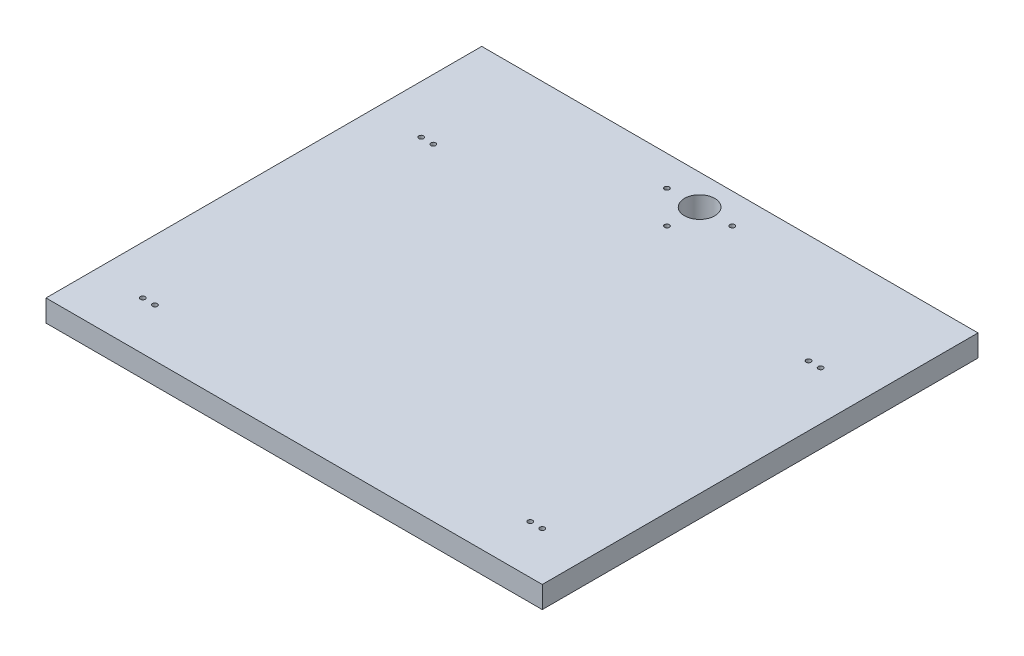
ISO-10303-21;
HEADER;
FILE_DESCRIPTION(('STEP AP214'),'2;1');
FILE_NAME('part.step','',(''),(''),'','','');
FILE_SCHEMA(('AUTOMOTIVE_DESIGN { 1 0 10303 214 1 1 1 1 }'));
ENDSEC;
DATA;
#1=APPLICATION_CONTEXT('core data for automotive mechanical design processes');
#2=APPLICATION_PROTOCOL_DEFINITION('international standard','automotive_design',2000,#1);
#3=PRODUCT_CONTEXT('',#1,'mechanical');
#4=PRODUCT('Part','Part','',(#3));
#5=PRODUCT_RELATED_PRODUCT_CATEGORY('part','',(#4));
#6=PRODUCT_DEFINITION_FORMATION('','',#4);
#7=PRODUCT_DEFINITION_CONTEXT('part definition',#1,'design');
#8=PRODUCT_DEFINITION('design','',#6,#7);
#9=PRODUCT_DEFINITION_SHAPE('','',#8);
#10=(LENGTH_UNIT() NAMED_UNIT(*) SI_UNIT(.MILLI.,.METRE.));
#11=(NAMED_UNIT(*) PLANE_ANGLE_UNIT() SI_UNIT($,.RADIAN.));
#12=(NAMED_UNIT(*) SI_UNIT($,.STERADIAN.) SOLID_ANGLE_UNIT());
#13=UNCERTAINTY_MEASURE_WITH_UNIT(LENGTH_MEASURE(1.E-05),#10,'distance_accuracy_value','');
#14=(GEOMETRIC_REPRESENTATION_CONTEXT(3) GLOBAL_UNCERTAINTY_ASSIGNED_CONTEXT((#13)) GLOBAL_UNIT_ASSIGNED_CONTEXT((#10,
#11,#12)) REPRESENTATION_CONTEXT('',''));
#15=CARTESIAN_POINT('',(0.,0.,0.));
#16=DIRECTION('',(0.,0.,1.));
#17=DIRECTION('',(1.,0.,0.));
#18=AXIS2_PLACEMENT_3D('',#15,#16,#17);
#19=CARTESIAN_POINT('',(40.,0.,-40.));
#20=DIRECTION('',(0.,1.,0.));
#21=DIRECTION('',(0.,0.,1.));
#22=AXIS2_PLACEMENT_3D('',#19,#20,#21);
#23=CYLINDRICAL_SURFACE('',#22,2.);
#24=CARTESIAN_POINT('',(40.,18.,-40.));
#25=DIRECTION('',(0.,1.,0.));
#26=DIRECTION('',(0.,0.,1.));
#27=AXIS2_PLACEMENT_3D('',#24,#25,#26);
#28=CIRCLE('',#27,2.);
#29=CARTESIAN_POINT('',(40.,18.,-38.));
#30=VERTEX_POINT('',#29);
#31=EDGE_CURVE('E2252',#30,#30,#28,.T.);
#32=ORIENTED_EDGE('',*,*,#31,.T.);
#33=EDGE_LOOP('',(#32));
#34=FACE_BOUND('',#33,.T.);
#35=CARTESIAN_POINT('',(40.,8.,-40.));
#36=DIRECTION('',(0.,-1.,0.));
#37=DIRECTION('',(0.,0.,-1.));
#38=AXIS2_PLACEMENT_3D('',#35,#36,#37);
#39=CIRCLE('',#38,2.);
#40=CARTESIAN_POINT('',(40.,8.,-42.));
#41=VERTEX_POINT('',#40);
#42=EDGE_CURVE('E2095',#41,#41,#39,.F.);
#43=ORIENTED_EDGE('',*,*,#42,.F.);
#44=EDGE_LOOP('',(#43));
#45=FACE_BOUND('',#44,.T.);
#46=ADVANCED_FACE('F2087',(#34,#45),#23,.F.);
#47=CARTESIAN_POINT('',(360.,0.,-270.));
#48=DIRECTION('',(0.,1.,0.));
#49=DIRECTION('',(0.,0.,1.));
#50=AXIS2_PLACEMENT_3D('',#47,#48,#49);
#51=CYLINDRICAL_SURFACE('',#50,2.);
#52=CARTESIAN_POINT('',(360.,18.,-270.));
#53=DIRECTION('',(0.,1.,0.));
#54=DIRECTION('',(0.,0.,1.));
#55=AXIS2_PLACEMENT_3D('',#52,#53,#54);
#56=CIRCLE('',#55,2.);
#57=CARTESIAN_POINT('',(360.,18.,-268.));
#58=VERTEX_POINT('',#57);
#59=EDGE_CURVE('E2242',#58,#58,#56,.T.);
#60=ORIENTED_EDGE('',*,*,#59,.T.);
#61=EDGE_LOOP('',(#60));
#62=FACE_BOUND('',#61,.T.);
#63=CARTESIAN_POINT('',(360.,8.,-270.));
#64=DIRECTION('',(0.,-1.,0.));
#65=DIRECTION('',(0.,0.,-1.));
#66=AXIS2_PLACEMENT_3D('',#63,#64,#65);
#67=CIRCLE('',#66,2.);
#68=CARTESIAN_POINT('',(360.,8.,-272.));
#69=VERTEX_POINT('',#68);
#70=EDGE_CURVE('E2215',#69,#69,#67,.F.);
#71=ORIENTED_EDGE('',*,*,#70,.F.);
#72=EDGE_LOOP('',(#71));
#73=FACE_BOUND('',#72,.T.);
#74=ADVANCED_FACE('F2414',(#62,#73),#51,.F.);
#75=CARTESIAN_POINT('',(40.,0.,-270.));
#76=DIRECTION('',(0.,1.,0.));
#77=DIRECTION('',(0.,0.,1.));
#78=AXIS2_PLACEMENT_3D('',#75,#76,#77);
#79=CYLINDRICAL_SURFACE('',#78,2.);
#80=CARTESIAN_POINT('',(40.,18.,-270.));
#81=DIRECTION('',(0.,1.,0.));
#82=DIRECTION('',(0.,0.,1.));
#83=AXIS2_PLACEMENT_3D('',#80,#81,#82);
#84=CIRCLE('',#83,2.);
#85=CARTESIAN_POINT('',(40.,18.,-268.));
#86=VERTEX_POINT('',#85);
#87=EDGE_CURVE('E2243',#86,#86,#84,.T.);
#88=ORIENTED_EDGE('',*,*,#87,.T.);
#89=EDGE_LOOP('',(#88));
#90=FACE_BOUND('',#89,.T.);
#91=CARTESIAN_POINT('',(40.,8.,-270.));
#92=DIRECTION('',(0.,-1.,0.));
#93=DIRECTION('',(0.,0.,-1.));
#94=AXIS2_PLACEMENT_3D('',#91,#92,#93);
#95=CIRCLE('',#94,2.);
#96=CARTESIAN_POINT('',(40.,8.,-272.));
#97=VERTEX_POINT('',#96);
#98=EDGE_CURVE('E2208',#97,#97,#95,.F.);
#99=ORIENTED_EDGE('',*,*,#98,.F.);
#100=EDGE_LOOP('',(#99));
#101=FACE_BOUND('',#100,.T.);
#102=ADVANCED_FACE('F2424',(#90,#101),#79,.F.);
#103=CARTESIAN_POINT('',(50.,0.,-270.));
#104=DIRECTION('',(0.,1.,0.));
#105=DIRECTION('',(0.,0.,1.));
#106=AXIS2_PLACEMENT_3D('',#103,#104,#105);
#107=CYLINDRICAL_SURFACE('',#106,2.);
#108=CARTESIAN_POINT('',(50.,18.,-270.));
#109=DIRECTION('',(0.,1.,0.));
#110=DIRECTION('',(0.,0.,1.));
#111=AXIS2_PLACEMENT_3D('',#108,#109,#110);
#112=CIRCLE('',#111,2.);
#113=CARTESIAN_POINT('',(50.,18.,-268.));
#114=VERTEX_POINT('',#113);
#115=EDGE_CURVE('E2236',#114,#114,#112,.T.);
#116=ORIENTED_EDGE('',*,*,#115,.T.);
#117=EDGE_LOOP('',(#116));
#118=FACE_BOUND('',#117,.T.);
#119=CARTESIAN_POINT('',(50.,8.,-270.));
#120=DIRECTION('',(0.,-1.,0.));
#121=DIRECTION('',(0.,0.,-1.));
#122=AXIS2_PLACEMENT_3D('',#119,#120,#121);
#123=CIRCLE('',#122,2.);
#124=CARTESIAN_POINT('',(50.,8.,-272.));
#125=VERTEX_POINT('',#124);
#126=EDGE_CURVE('E2203',#125,#125,#123,.F.);
#127=ORIENTED_EDGE('',*,*,#126,.F.);
#128=EDGE_LOOP('',(#127));
#129=FACE_BOUND('',#128,.T.);
#130=ADVANCED_FACE('F2537',(#118,#129),#107,.F.);
#131=CARTESIAN_POINT('',(370.,0.,-270.));
#132=DIRECTION('',(0.,1.,0.));
#133=DIRECTION('',(0.,0.,1.));
#134=AXIS2_PLACEMENT_3D('',#131,#132,#133);
#135=CYLINDRICAL_SURFACE('',#134,2.);
#136=CARTESIAN_POINT('',(370.,18.,-270.));
#137=DIRECTION('',(0.,1.,0.));
#138=DIRECTION('',(0.,0.,1.));
#139=AXIS2_PLACEMENT_3D('',#136,#137,#138);
#140=CIRCLE('',#139,2.);
#141=CARTESIAN_POINT('',(370.,18.,-268.));
#142=VERTEX_POINT('',#141);
#143=EDGE_CURVE('E2248',#142,#142,#140,.T.);
#144=ORIENTED_EDGE('',*,*,#143,.T.);
#145=EDGE_LOOP('',(#144));
#146=FACE_BOUND('',#145,.T.);
#147=CARTESIAN_POINT('',(370.,8.,-270.));
#148=DIRECTION('',(0.,-1.,0.));
#149=DIRECTION('',(0.,0.,-1.));
#150=AXIS2_PLACEMENT_3D('',#147,#148,#149);
#151=CIRCLE('',#150,2.);
#152=CARTESIAN_POINT('',(370.,8.,-272.));
#153=VERTEX_POINT('',#152);
#154=EDGE_CURVE('E2202',#153,#153,#151,.F.);
#155=ORIENTED_EDGE('',*,*,#154,.F.);
#156=EDGE_LOOP('',(#155));
#157=FACE_BOUND('',#156,.T.);
#158=ADVANCED_FACE('F2430',(#146,#157),#135,.F.);
#159=CARTESIAN_POINT('',(370.,0.,-40.));
#160=DIRECTION('',(0.,1.,0.));
#161=DIRECTION('',(0.,0.,1.));
#162=AXIS2_PLACEMENT_3D('',#159,#160,#161);
#163=CYLINDRICAL_SURFACE('',#162,2.);
#164=CARTESIAN_POINT('',(370.,18.,-40.));
#165=DIRECTION('',(0.,1.,0.));
#166=DIRECTION('',(0.,0.,1.));
#167=AXIS2_PLACEMENT_3D('',#164,#165,#166);
#168=CIRCLE('',#167,2.);
#169=CARTESIAN_POINT('',(370.,18.,-38.));
#170=VERTEX_POINT('',#169);
#171=EDGE_CURVE('E2257',#170,#170,#168,.T.);
#172=ORIENTED_EDGE('',*,*,#171,.T.);
#173=EDGE_LOOP('',(#172));
#174=FACE_BOUND('',#173,.T.);
#175=CARTESIAN_POINT('',(370.,8.,-40.));
#176=DIRECTION('',(0.,-1.,0.));
#177=DIRECTION('',(0.,0.,-1.));
#178=AXIS2_PLACEMENT_3D('',#175,#176,#177);
#179=CIRCLE('',#178,2.);
#180=CARTESIAN_POINT('',(370.,8.,-42.));
#181=VERTEX_POINT('',#180);
#182=EDGE_CURVE('E2200',#181,#181,#179,.F.);
#183=ORIENTED_EDGE('',*,*,#182,.F.);
#184=EDGE_LOOP('',(#183));
#185=FACE_BOUND('',#184,.T.);
#186=ADVANCED_FACE('F2554',(#174,#185),#163,.F.);
#187=CARTESIAN_POINT('',(360.,0.,-40.));
#188=DIRECTION('',(0.,1.,0.));
#189=DIRECTION('',(0.,0.,1.));
#190=AXIS2_PLACEMENT_3D('',#187,#188,#189);
#191=CYLINDRICAL_SURFACE('',#190,2.);
#192=CARTESIAN_POINT('',(360.,18.,-40.));
#193=DIRECTION('',(0.,1.,0.));
#194=DIRECTION('',(0.,0.,1.));
#195=AXIS2_PLACEMENT_3D('',#192,#193,#194);
#196=CIRCLE('',#195,2.);
#197=CARTESIAN_POINT('',(360.,18.,-38.));
#198=VERTEX_POINT('',#197);
#199=EDGE_CURVE('E2254',#198,#198,#196,.T.);
#200=ORIENTED_EDGE('',*,*,#199,.T.);
#201=EDGE_LOOP('',(#200));
#202=FACE_BOUND('',#201,.T.);
#203=CARTESIAN_POINT('',(360.,8.,-40.));
#204=DIRECTION('',(0.,-1.,0.));
#205=DIRECTION('',(0.,0.,-1.));
#206=AXIS2_PLACEMENT_3D('',#203,#204,#205);
#207=CIRCLE('',#206,2.);
#208=CARTESIAN_POINT('',(360.,8.,-42.));
#209=VERTEX_POINT('',#208);
#210=EDGE_CURVE('E2193',#209,#209,#207,.F.);
#211=ORIENTED_EDGE('',*,*,#210,.F.);
#212=EDGE_LOOP('',(#211));
#213=FACE_BOUND('',#212,.T.);
#214=ADVANCED_FACE('F2546',(#202,#213),#191,.F.);
#215=CARTESIAN_POINT('',(50.,0.,-40.));
#216=DIRECTION('',(0.,1.,0.));
#217=DIRECTION('',(0.,0.,1.));
#218=AXIS2_PLACEMENT_3D('',#215,#216,#217);
#219=CYLINDRICAL_SURFACE('',#218,2.);
#220=CARTESIAN_POINT('',(50.,18.,-40.));
#221=DIRECTION('',(0.,1.,0.));
#222=DIRECTION('',(0.,0.,1.));
#223=AXIS2_PLACEMENT_3D('',#220,#221,#222);
#224=CIRCLE('',#223,2.);
#225=CARTESIAN_POINT('',(50.,18.,-38.));
#226=VERTEX_POINT('',#225);
#227=EDGE_CURVE('E2247',#226,#226,#224,.T.);
#228=ORIENTED_EDGE('',*,*,#227,.T.);
#229=EDGE_LOOP('',(#228));
#230=FACE_BOUND('',#229,.T.);
#231=CARTESIAN_POINT('',(50.,8.,-40.));
#232=DIRECTION('',(0.,-1.,0.));
#233=DIRECTION('',(0.,0.,-1.));
#234=AXIS2_PLACEMENT_3D('',#231,#232,#233);
#235=CIRCLE('',#234,2.);
#236=CARTESIAN_POINT('',(50.,8.,-42.));
#237=VERTEX_POINT('',#236);
#238=EDGE_CURVE('E2187',#237,#237,#235,.F.);
#239=ORIENTED_EDGE('',*,*,#238,.F.);
#240=EDGE_LOOP('',(#239));
#241=FACE_BOUND('',#240,.T.);
#242=ADVANCED_FACE('F2540',(#230,#241),#219,.F.);
#243=CARTESIAN_POINT('',(232.,18.,-335.));
#244=DIRECTION('',(0.,-1.,0.));
#245=DIRECTION('',(0.,0.,-1.));
#246=AXIS2_PLACEMENT_3D('',#243,#244,#245);
#247=CYLINDRICAL_SURFACE('',#246,2.);
#248=CARTESIAN_POINT('',(232.,18.,-335.));
#249=DIRECTION('',(0.,-1.,0.));
#250=DIRECTION('',(0.,0.,-1.));
#251=AXIS2_PLACEMENT_3D('',#248,#249,#250);
#252=CIRCLE('',#251,2.);
#253=CARTESIAN_POINT('',(232.,18.,-337.));
#254=VERTEX_POINT('',#253);
#255=EDGE_CURVE('E2219',#254,#254,#252,.T.);
#256=ORIENTED_EDGE('',*,*,#255,.F.);
#257=EDGE_LOOP('',(#256));
#258=FACE_BOUND('',#257,.T.);
#259=CARTESIAN_POINT('',(232.,8.,-335.));
#260=DIRECTION('',(0.,-1.,0.));
#261=DIRECTION('',(0.,0.,-1.));
#262=AXIS2_PLACEMENT_3D('',#259,#260,#261);
#263=CIRCLE('',#262,2.);
#264=CARTESIAN_POINT('',(232.,8.,-337.));
#265=VERTEX_POINT('',#264);
#266=EDGE_CURVE('E2182',#265,#265,#263,.F.);
#267=ORIENTED_EDGE('',*,*,#266,.F.);
#268=EDGE_LOOP('',(#267));
#269=FACE_BOUND('',#268,.T.);
#270=ADVANCED_FACE('F2535',(#258,#269),#247,.F.);
#271=CARTESIAN_POINT('',(178.,18.,-335.));
#272=DIRECTION('',(0.,-1.,0.));
#273=DIRECTION('',(0.,0.,-1.));
#274=AXIS2_PLACEMENT_3D('',#271,#272,#273);
#275=CYLINDRICAL_SURFACE('',#274,2.);
#276=CARTESIAN_POINT('',(178.,18.,-335.));
#277=DIRECTION('',(0.,-1.,0.));
#278=DIRECTION('',(0.,0.,-1.));
#279=AXIS2_PLACEMENT_3D('',#276,#277,#278);
#280=CIRCLE('',#279,2.);
#281=CARTESIAN_POINT('',(178.,18.,-337.));
#282=VERTEX_POINT('',#281);
#283=EDGE_CURVE('E2229',#282,#282,#280,.T.);
#284=ORIENTED_EDGE('',*,*,#283,.F.);
#285=EDGE_LOOP('',(#284));
#286=FACE_BOUND('',#285,.T.);
#287=CARTESIAN_POINT('',(178.,8.,-335.));
#288=DIRECTION('',(0.,-1.,0.));
#289=DIRECTION('',(0.,0.,-1.));
#290=AXIS2_PLACEMENT_3D('',#287,#288,#289);
#291=CIRCLE('',#290,2.);
#292=CARTESIAN_POINT('',(178.,8.,-337.));
#293=VERTEX_POINT('',#292);
#294=EDGE_CURVE('E2179',#293,#293,#291,.F.);
#295=ORIENTED_EDGE('',*,*,#294,.F.);
#296=EDGE_LOOP('',(#295));
#297=FACE_BOUND('',#296,.T.);
#298=ADVANCED_FACE('F2526',(#286,#297),#275,.F.);
#299=CARTESIAN_POINT('',(205.,18.,-308.));
#300=DIRECTION('',(0.,-1.,0.));
#301=DIRECTION('',(0.,0.,-1.));
#302=AXIS2_PLACEMENT_3D('',#299,#300,#301);
#303=CYLINDRICAL_SURFACE('',#302,2.);
#304=CARTESIAN_POINT('',(205.,18.,-308.));
#305=DIRECTION('',(0.,-1.,0.));
#306=DIRECTION('',(0.,0.,-1.));
#307=AXIS2_PLACEMENT_3D('',#304,#305,#306);
#308=CIRCLE('',#307,2.);
#309=CARTESIAN_POINT('',(205.,18.,-310.));
#310=VERTEX_POINT('',#309);
#311=EDGE_CURVE('E2233',#310,#310,#308,.T.);
#312=ORIENTED_EDGE('',*,*,#311,.F.);
#313=EDGE_LOOP('',(#312));
#314=FACE_BOUND('',#313,.T.);
#315=CARTESIAN_POINT('',(205.,8.,-308.));
#316=DIRECTION('',(0.,-1.,0.));
#317=DIRECTION('',(0.,0.,-1.));
#318=AXIS2_PLACEMENT_3D('',#315,#316,#317);
#319=CIRCLE('',#318,2.);
#320=CARTESIAN_POINT('',(205.,8.,-310.));
#321=VERTEX_POINT('',#320);
#322=EDGE_CURVE('E2178',#321,#321,#319,.F.);
#323=ORIENTED_EDGE('',*,*,#322,.F.);
#324=EDGE_LOOP('',(#323));
#325=FACE_BOUND('',#324,.T.);
#326=ADVANCED_FACE('F2527',(#314,#325),#303,.F.);
#327=CARTESIAN_POINT('',(0.,18.,0.));
#328=DIRECTION('',(1.,0.,0.));
#329=DIRECTION('',(0.,0.,-1.));
#330=AXIS2_PLACEMENT_3D('',#327,#328,#329);
#331=PLANE('',#330);
#332=DIRECTION('',(0.,0.,1.));
#333=VECTOR('',#332,1.);
#334=CARTESIAN_POINT('',(0.,0.,0.));
#335=LINE('',#334,#333);
#336=CARTESIAN_POINT('',(0.,0.,-360.));
#337=VERTEX_POINT('',#336);
#338=CARTESIAN_POINT('',(0.,0.,0.));
#339=VERTEX_POINT('',#338);
#340=EDGE_CURVE('E2164',#337,#339,#335,.T.);
#341=ORIENTED_EDGE('',*,*,#340,.T.);
#342=DIRECTION('',(0.,-1.,0.));
#343=VECTOR('',#342,1.);
#344=CARTESIAN_POINT('',(0.,18.,0.));
#345=LINE('',#344,#343);
#346=CARTESIAN_POINT('',(0.,18.,0.));
#347=VERTEX_POINT('',#346);
#348=EDGE_CURVE('E14',#347,#339,#345,.T.);
#349=ORIENTED_EDGE('',*,*,#348,.F.);
#350=DIRECTION('',(0.,0.,1.));
#351=VECTOR('',#350,1.);
#352=CARTESIAN_POINT('',(0.,18.,0.));
#353=LINE('',#352,#351);
#354=CARTESIAN_POINT('',(0.,18.,-360.));
#355=VERTEX_POINT('',#354);
#356=EDGE_CURVE('E2145',#355,#347,#353,.T.);
#357=ORIENTED_EDGE('',*,*,#356,.F.);
#358=DIRECTION('',(0.,-1.,0.));
#359=VECTOR('',#358,1.);
#360=CARTESIAN_POINT('',(0.,18.,-360.));
#361=LINE('',#360,#359);
#362=EDGE_CURVE('E2160',#355,#337,#361,.T.);
#363=ORIENTED_EDGE('',*,*,#362,.T.);
#364=EDGE_LOOP('',(#341,#349,#357,#363));
#365=FACE_BOUND('',#364,.T.);
#366=ADVANCED_FACE('F2089',(#365),#331,.F.);
#367=CARTESIAN_POINT('',(0.,18.,0.));
#368=DIRECTION('',(0.,0.,-1.));
#369=DIRECTION('',(-1.,0.,0.));
#370=AXIS2_PLACEMENT_3D('',#367,#368,#369);
#371=PLANE('',#370);
#372=DIRECTION('',(1.,0.,0.));
#373=VECTOR('',#372,1.);
#374=CARTESIAN_POINT('',(0.,0.,0.));
#375=LINE('',#374,#373);
#376=CARTESIAN_POINT('',(410.,0.,0.));
#377=VERTEX_POINT('',#376);
#378=EDGE_CURVE('E2148',#339,#377,#375,.T.);
#379=ORIENTED_EDGE('',*,*,#378,.T.);
#380=DIRECTION('',(0.,-1.,0.));
#381=VECTOR('',#380,1.);
#382=CARTESIAN_POINT('',(410.,18.,0.));
#383=LINE('',#382,#381);
#384=CARTESIAN_POINT('',(410.,18.,0.));
#385=VERTEX_POINT('',#384);
#386=EDGE_CURVE('E2098',#385,#377,#383,.T.);
#387=ORIENTED_EDGE('',*,*,#386,.F.);
#388=DIRECTION('',(1.,0.,0.));
#389=VECTOR('',#388,1.);
#390=CARTESIAN_POINT('',(0.,18.,0.));
#391=LINE('',#390,#389);
#392=EDGE_CURVE('E2139',#347,#385,#391,.T.);
#393=ORIENTED_EDGE('',*,*,#392,.F.);
#394=ORIENTED_EDGE('',*,*,#348,.T.);
#395=EDGE_LOOP('',(#379,#387,#393,#394));
#396=FACE_BOUND('',#395,.T.);
#397=ADVANCED_FACE('F2150',(#396),#371,.F.);
#398=CARTESIAN_POINT('',(410.,18.,0.));
#399=DIRECTION('',(-1.,0.,0.));
#400=DIRECTION('',(0.,0.,1.));
#401=AXIS2_PLACEMENT_3D('',#398,#399,#400);
#402=PLANE('',#401);
#403=DIRECTION('',(0.,0.,-1.));
#404=VECTOR('',#403,1.);
#405=CARTESIAN_POINT('',(410.,0.,0.));
#406=LINE('',#405,#404);
#407=CARTESIAN_POINT('',(410.,0.,-360.));
#408=VERTEX_POINT('',#407);
#409=EDGE_CURVE('E2124',#377,#408,#406,.T.);
#410=ORIENTED_EDGE('',*,*,#409,.T.);
#411=DIRECTION('',(0.,-1.,0.));
#412=VECTOR('',#411,1.);
#413=CARTESIAN_POINT('',(410.,18.,-360.));
#414=LINE('',#413,#412);
#415=CARTESIAN_POINT('',(410.,18.,-360.));
#416=VERTEX_POINT('',#415);
#417=EDGE_CURVE('E2149',#416,#408,#414,.T.);
#418=ORIENTED_EDGE('',*,*,#417,.F.);
#419=DIRECTION('',(0.,0.,-1.));
#420=VECTOR('',#419,1.);
#421=CARTESIAN_POINT('',(410.,18.,0.));
#422=LINE('',#421,#420);
#423=EDGE_CURVE('E2144',#385,#416,#422,.T.);
#424=ORIENTED_EDGE('',*,*,#423,.F.);
#425=ORIENTED_EDGE('',*,*,#386,.T.);
#426=EDGE_LOOP('',(#410,#418,#424,#425));
#427=FACE_BOUND('',#426,.T.);
#428=ADVANCED_FACE('F2155',(#427),#402,.F.);
#429=CARTESIAN_POINT('',(0.,18.,-360.));
#430=DIRECTION('',(0.,0.,1.));
#431=DIRECTION('',(1.,0.,0.));
#432=AXIS2_PLACEMENT_3D('',#429,#430,#431);
#433=PLANE('',#432);
#434=DIRECTION('',(-1.,0.,0.));
#435=VECTOR('',#434,1.);
#436=CARTESIAN_POINT('',(0.,0.,-360.));
#437=LINE('',#436,#435);
#438=EDGE_CURVE('E2131',#408,#337,#437,.T.);
#439=ORIENTED_EDGE('',*,*,#438,.T.);
#440=ORIENTED_EDGE('',*,*,#362,.F.);
#441=DIRECTION('',(-1.,0.,0.));
#442=VECTOR('',#441,1.);
#443=CARTESIAN_POINT('',(0.,18.,-360.));
#444=LINE('',#443,#442);
#445=EDGE_CURVE('E2110',#416,#355,#444,.T.);
#446=ORIENTED_EDGE('',*,*,#445,.F.);
#447=ORIENTED_EDGE('',*,*,#417,.T.);
#448=EDGE_LOOP('',(#439,#440,#446,#447));
#449=FACE_BOUND('',#448,.T.);
#450=ADVANCED_FACE('F2403',(#449),#433,.F.);
#451=CARTESIAN_POINT('',(0.,18.,0.));
#452=DIRECTION('',(0.,-1.,0.));
#453=DIRECTION('',(0.,0.,-1.));
#454=AXIS2_PLACEMENT_3D('',#451,#452,#453);
#455=PLANE('',#454);
#456=ORIENTED_EDGE('',*,*,#311,.T.);
#457=EDGE_LOOP('',(#456));
#458=FACE_BOUND('',#457,.T.);
#459=ORIENTED_EDGE('',*,*,#283,.T.);
#460=EDGE_LOOP('',(#459));
#461=FACE_BOUND('',#460,.T.);
#462=ORIENTED_EDGE('',*,*,#255,.T.);
#463=EDGE_LOOP('',(#462));
#464=FACE_BOUND('',#463,.T.);
#465=ORIENTED_EDGE('',*,*,#227,.F.);
#466=EDGE_LOOP('',(#465));
#467=FACE_BOUND('',#466,.T.);
#468=ORIENTED_EDGE('',*,*,#199,.F.);
#469=EDGE_LOOP('',(#468));
#470=FACE_BOUND('',#469,.T.);
#471=ORIENTED_EDGE('',*,*,#171,.F.);
#472=EDGE_LOOP('',(#471));
#473=FACE_BOUND('',#472,.T.);
#474=ORIENTED_EDGE('',*,*,#143,.F.);
#475=EDGE_LOOP('',(#474));
#476=FACE_BOUND('',#475,.T.);
#477=ORIENTED_EDGE('',*,*,#115,.F.);
#478=EDGE_LOOP('',(#477));
#479=FACE_BOUND('',#478,.T.);
#480=ORIENTED_EDGE('',*,*,#87,.F.);
#481=EDGE_LOOP('',(#480));
#482=FACE_BOUND('',#481,.T.);
#483=ORIENTED_EDGE('',*,*,#59,.F.);
#484=EDGE_LOOP('',(#483));
#485=FACE_BOUND('',#484,.T.);
#486=ORIENTED_EDGE('',*,*,#31,.F.);
#487=EDGE_LOOP('',(#486));
#488=FACE_BOUND('',#487,.T.);
#489=CARTESIAN_POINT('',(205.,18.,-335.));
#490=DIRECTION('',(0.,1.,0.));
#491=DIRECTION('',(0.,0.,1.));
#492=AXIS2_PLACEMENT_3D('',#489,#490,#491);
#493=CIRCLE('',#492,12.5);
#494=CARTESIAN_POINT('',(205.,18.,-322.5));
#495=VERTEX_POINT('',#494);
#496=EDGE_CURVE('E2266',#495,#495,#493,.T.);
#497=ORIENTED_EDGE('',*,*,#496,.F.);
#498=EDGE_LOOP('',(#497));
#499=FACE_BOUND('',#498,.T.);
#500=ORIENTED_EDGE('',*,*,#356,.T.);
#501=ORIENTED_EDGE('',*,*,#392,.T.);
#502=ORIENTED_EDGE('',*,*,#423,.T.);
#503=ORIENTED_EDGE('',*,*,#445,.T.);
#504=EDGE_LOOP('',(#500,#501,#502,#503));
#505=FACE_BOUND('',#504,.T.);
#506=ADVANCED_FACE('F2136',(#458,#461,#464,#467,#470,#473,#476,#479,#482,#485,#488,#499,#505),
#455,.F.);
#507=CARTESIAN_POINT('',(0.,0.,0.));
#508=DIRECTION('',(0.,-1.,0.));
#509=DIRECTION('',(0.,0.,-1.));
#510=AXIS2_PLACEMENT_3D('',#507,#508,#509);
#511=PLANE('',#510);
#512=CARTESIAN_POINT('',(360.,0.,-270.));
#513=DIRECTION('',(0.,-1.,0.));
#514=DIRECTION('',(0.,0.,-1.));
#515=AXIS2_PLACEMENT_3D('',#512,#513,#514);
#516=CIRCLE('',#515,3.99999999999999);
#517=CARTESIAN_POINT('',(360.,0.,-274.));
#518=VERTEX_POINT('',#517);
#519=EDGE_CURVE('E2315',#518,#518,#516,.T.);
#520=ORIENTED_EDGE('',*,*,#519,.F.);
#521=EDGE_LOOP('',(#520));
#522=FACE_BOUND('',#521,.T.);
#523=CARTESIAN_POINT('',(50.,0.,-270.));
#524=DIRECTION('',(0.,-1.,0.));
#525=DIRECTION('',(0.,0.,-1.));
#526=AXIS2_PLACEMENT_3D('',#523,#524,#525);
#527=CIRCLE('',#526,4.00000000000001);
#528=CARTESIAN_POINT('',(50.,0.,-274.));
#529=VERTEX_POINT('',#528);
#530=EDGE_CURVE('E2343',#529,#529,#527,.T.);
#531=ORIENTED_EDGE('',*,*,#530,.F.);
#532=EDGE_LOOP('',(#531));
#533=FACE_BOUND('',#532,.T.);
#534=CARTESIAN_POINT('',(40.,0.,-270.));
#535=DIRECTION('',(0.,-1.,0.));
#536=DIRECTION('',(0.,0.,-1.));
#537=AXIS2_PLACEMENT_3D('',#534,#535,#536);
#538=CIRCLE('',#537,4.);
#539=CARTESIAN_POINT('',(40.,0.,-274.));
#540=VERTEX_POINT('',#539);
#541=EDGE_CURVE('E2342',#540,#540,#538,.T.);
#542=ORIENTED_EDGE('',*,*,#541,.F.);
#543=EDGE_LOOP('',(#542));
#544=FACE_BOUND('',#543,.T.);
#545=CARTESIAN_POINT('',(178.,0.,-335.));
#546=DIRECTION('',(0.,-1.,0.));
#547=DIRECTION('',(0.,0.,-1.));
#548=AXIS2_PLACEMENT_3D('',#545,#546,#547);
#549=CIRCLE('',#548,3.99999999999999);
#550=CARTESIAN_POINT('',(178.,0.,-339.));
#551=VERTEX_POINT('',#550);
#552=EDGE_CURVE('E2358',#551,#551,#549,.T.);
#553=ORIENTED_EDGE('',*,*,#552,.F.);
#554=EDGE_LOOP('',(#553));
#555=FACE_BOUND('',#554,.T.);
#556=CARTESIAN_POINT('',(370.,0.,-270.));
#557=DIRECTION('',(0.,-1.,0.));
#558=DIRECTION('',(0.,0.,-1.));
#559=AXIS2_PLACEMENT_3D('',#556,#557,#558);
#560=CIRCLE('',#559,3.99999999999999);
#561=CARTESIAN_POINT('',(370.,0.,-274.));
#562=VERTEX_POINT('',#561);
#563=EDGE_CURVE('E2313',#562,#562,#560,.T.);
#564=ORIENTED_EDGE('',*,*,#563,.F.);
#565=EDGE_LOOP('',(#564));
#566=FACE_BOUND('',#565,.T.);
#567=CARTESIAN_POINT('',(370.,0.,-40.));
#568=DIRECTION('',(0.,-1.,0.));
#569=DIRECTION('',(0.,0.,-1.));
#570=AXIS2_PLACEMENT_3D('',#567,#568,#569);
#571=CIRCLE('',#570,3.99999999999999);
#572=CARTESIAN_POINT('',(370.,0.,-44.));
#573=VERTEX_POINT('',#572);
#574=EDGE_CURVE('E2319',#573,#573,#571,.T.);
#575=ORIENTED_EDGE('',*,*,#574,.F.);
#576=EDGE_LOOP('',(#575));
#577=FACE_BOUND('',#576,.T.);
#578=CARTESIAN_POINT('',(360.,0.,-40.));
#579=DIRECTION('',(0.,-1.,0.));
#580=DIRECTION('',(0.,0.,-1.));
#581=AXIS2_PLACEMENT_3D('',#578,#579,#580);
#582=CIRCLE('',#581,3.99999999999999);
#583=CARTESIAN_POINT('',(360.,0.,-44.));
#584=VERTEX_POINT('',#583);
#585=EDGE_CURVE('E2327',#584,#584,#582,.T.);
#586=ORIENTED_EDGE('',*,*,#585,.F.);
#587=EDGE_LOOP('',(#586));
#588=FACE_BOUND('',#587,.T.);
#589=CARTESIAN_POINT('',(50.,0.,-40.));
#590=DIRECTION('',(0.,-1.,0.));
#591=DIRECTION('',(0.,0.,-1.));
#592=AXIS2_PLACEMENT_3D('',#589,#590,#591);
#593=CIRCLE('',#592,4.00000000000001);
#594=CARTESIAN_POINT('',(50.,0.,-44.));
#595=VERTEX_POINT('',#594);
#596=EDGE_CURVE('E2305',#595,#595,#593,.T.);
#597=ORIENTED_EDGE('',*,*,#596,.F.);
#598=EDGE_LOOP('',(#597));
#599=FACE_BOUND('',#598,.T.);
#600=CARTESIAN_POINT('',(205.,0.,-308.));
#601=DIRECTION('',(0.,-1.,0.));
#602=DIRECTION('',(0.,0.,-1.));
#603=AXIS2_PLACEMENT_3D('',#600,#601,#602);
#604=CIRCLE('',#603,3.99999999999999);
#605=CARTESIAN_POINT('',(205.,0.,-312.));
#606=VERTEX_POINT('',#605);
#607=EDGE_CURVE('E2357',#606,#606,#604,.T.);
#608=ORIENTED_EDGE('',*,*,#607,.F.);
#609=EDGE_LOOP('',(#608));
#610=FACE_BOUND('',#609,.T.);
#611=CARTESIAN_POINT('',(232.,0.,-335.));
#612=DIRECTION('',(0.,-1.,0.));
#613=DIRECTION('',(0.,0.,-1.));
#614=AXIS2_PLACEMENT_3D('',#611,#612,#613);
#615=CIRCLE('',#614,3.99999999999999);
#616=CARTESIAN_POINT('',(232.,0.,-339.));
#617=VERTEX_POINT('',#616);
#618=EDGE_CURVE('E2374',#617,#617,#615,.T.);
#619=ORIENTED_EDGE('',*,*,#618,.F.);
#620=EDGE_LOOP('',(#619));
#621=FACE_BOUND('',#620,.T.);
#622=CARTESIAN_POINT('',(40.,0.,-40.));
#623=DIRECTION('',(0.,-1.,0.));
#624=DIRECTION('',(0.,0.,-1.));
#625=AXIS2_PLACEMENT_3D('',#622,#623,#624);
#626=CIRCLE('',#625,4.);
#627=CARTESIAN_POINT('',(40.,0.,-44.));
#628=VERTEX_POINT('',#627);
#629=EDGE_CURVE('E2297',#628,#628,#626,.T.);
#630=ORIENTED_EDGE('',*,*,#629,.F.);
#631=EDGE_LOOP('',(#630));
#632=FACE_BOUND('',#631,.T.);
#633=CARTESIAN_POINT('',(205.,0.,-335.));
#634=DIRECTION('',(0.,1.,0.));
#635=DIRECTION('',(0.,0.,1.));
#636=AXIS2_PLACEMENT_3D('',#633,#634,#635);
#637=CIRCLE('',#636,12.5);
#638=CARTESIAN_POINT('',(205.,0.,-322.5));
#639=VERTEX_POINT('',#638);
#640=EDGE_CURVE('E2162',#639,#639,#637,.T.);
#641=ORIENTED_EDGE('',*,*,#640,.T.);
#642=EDGE_LOOP('',(#641));
#643=FACE_BOUND('',#642,.T.);
#644=ORIENTED_EDGE('',*,*,#340,.F.);
#645=ORIENTED_EDGE('',*,*,#438,.F.);
#646=ORIENTED_EDGE('',*,*,#409,.F.);
#647=ORIENTED_EDGE('',*,*,#378,.F.);
#648=EDGE_LOOP('',(#644,#645,#646,#647));
#649=FACE_BOUND('',#648,.T.);
#650=ADVANCED_FACE('F2389',(#522,#533,#544,#555,#566,#577,#588,#599,#610,#621,#632,#643,#649),
#511,.T.);
#651=CARTESIAN_POINT('',(205.,0.,-335.));
#652=DIRECTION('',(0.,1.,0.));
#653=DIRECTION('',(0.,0.,1.));
#654=AXIS2_PLACEMENT_3D('',#651,#652,#653);
#655=CYLINDRICAL_SURFACE('',#654,12.5);
#656=ORIENTED_EDGE('',*,*,#640,.F.);
#657=EDGE_LOOP('',(#656));
#658=FACE_BOUND('',#657,.T.);
#659=ORIENTED_EDGE('',*,*,#496,.T.);
#660=EDGE_LOOP('',(#659));
#661=FACE_BOUND('',#660,.T.);
#662=ADVANCED_FACE('F2392',(#658,#661),#655,.F.);
#663=CARTESIAN_POINT('',(205.,8.,-308.));
#664=DIRECTION('',(0.,-1.,0.));
#665=DIRECTION('',(0.,0.,-1.));
#666=AXIS2_PLACEMENT_3D('',#663,#664,#665);
#667=PLANE('',#666);
#668=CARTESIAN_POINT('',(205.,8.,-308.));
#669=DIRECTION('',(0.,-1.,0.));
#670=DIRECTION('',(0.,0.,-1.));
#671=AXIS2_PLACEMENT_3D('',#668,#669,#670);
#672=CIRCLE('',#671,3.99999999999999);
#673=CARTESIAN_POINT('',(205.,8.,-312.));
#674=VERTEX_POINT('',#673);
#675=EDGE_CURVE('E2379',#674,#674,#672,.T.);
#676=ORIENTED_EDGE('',*,*,#675,.T.);
#677=EDGE_LOOP('',(#676));
#678=FACE_BOUND('',#677,.T.);
#679=ORIENTED_EDGE('',*,*,#322,.T.);
#680=EDGE_LOOP('',(#679));
#681=FACE_BOUND('',#680,.T.);
#682=ADVANCED_FACE('F2427',(#678,#681),#667,.T.);
#683=CARTESIAN_POINT('',(205.,8.,-308.));
#684=DIRECTION('',(0.,-1.,0.));
#685=DIRECTION('',(0.,0.,-1.));
#686=AXIS2_PLACEMENT_3D('',#683,#684,#685);
#687=CYLINDRICAL_SURFACE('',#686,3.99999999999999);
#688=ORIENTED_EDGE('',*,*,#675,.F.);
#689=EDGE_LOOP('',(#688));
#690=FACE_BOUND('',#689,.T.);
#691=ORIENTED_EDGE('',*,*,#607,.T.);
#692=EDGE_LOOP('',(#691));
#693=FACE_BOUND('',#692,.T.);
#694=ADVANCED_FACE('F2388',(#690,#693),#687,.F.);
#695=CARTESIAN_POINT('',(178.,8.,-335.));
#696=DIRECTION('',(0.,-1.,0.));
#697=DIRECTION('',(0.,0.,-1.));
#698=AXIS2_PLACEMENT_3D('',#695,#696,#697);
#699=PLANE('',#698);
#700=CARTESIAN_POINT('',(178.,8.,-335.));
#701=DIRECTION('',(0.,-1.,0.));
#702=DIRECTION('',(0.,0.,-1.));
#703=AXIS2_PLACEMENT_3D('',#700,#701,#702);
#704=CIRCLE('',#703,3.99999999999999);
#705=CARTESIAN_POINT('',(178.,8.,-339.));
#706=VERTEX_POINT('',#705);
#707=EDGE_CURVE('E2353',#706,#706,#704,.T.);
#708=ORIENTED_EDGE('',*,*,#707,.T.);
#709=EDGE_LOOP('',(#708));
#710=FACE_BOUND('',#709,.T.);
#711=ORIENTED_EDGE('',*,*,#294,.T.);
#712=EDGE_LOOP('',(#711));
#713=FACE_BOUND('',#712,.T.);
#714=ADVANCED_FACE('F2445',(#710,#713),#699,.T.);
#715=CARTESIAN_POINT('',(178.,8.,-335.));
#716=DIRECTION('',(0.,-1.,0.));
#717=DIRECTION('',(0.,0.,-1.));
#718=AXIS2_PLACEMENT_3D('',#715,#716,#717);
#719=CYLINDRICAL_SURFACE('',#718,3.99999999999999);
#720=ORIENTED_EDGE('',*,*,#707,.F.);
#721=EDGE_LOOP('',(#720));
#722=FACE_BOUND('',#721,.T.);
#723=ORIENTED_EDGE('',*,*,#552,.T.);
#724=EDGE_LOOP('',(#723));
#725=FACE_BOUND('',#724,.T.);
#726=ADVANCED_FACE('F2454',(#722,#725),#719,.F.);
#727=CARTESIAN_POINT('',(232.,8.,-335.));
#728=DIRECTION('',(0.,-1.,0.));
#729=DIRECTION('',(0.,0.,-1.));
#730=AXIS2_PLACEMENT_3D('',#727,#728,#729);
#731=PLANE('',#730);
#732=CARTESIAN_POINT('',(232.,8.,-335.));
#733=DIRECTION('',(0.,-1.,0.));
#734=DIRECTION('',(0.,0.,-1.));
#735=AXIS2_PLACEMENT_3D('',#732,#733,#734);
#736=CIRCLE('',#735,3.99999999999999);
#737=CARTESIAN_POINT('',(232.,8.,-339.));
#738=VERTEX_POINT('',#737);
#739=EDGE_CURVE('E2373',#738,#738,#736,.T.);
#740=ORIENTED_EDGE('',*,*,#739,.T.);
#741=EDGE_LOOP('',(#740));
#742=FACE_BOUND('',#741,.T.);
#743=ORIENTED_EDGE('',*,*,#266,.T.);
#744=EDGE_LOOP('',(#743));
#745=FACE_BOUND('',#744,.T.);
#746=ADVANCED_FACE('F2451',(#742,#745),#731,.T.);
#747=CARTESIAN_POINT('',(232.,8.,-335.));
#748=DIRECTION('',(0.,-1.,0.));
#749=DIRECTION('',(0.,0.,-1.));
#750=AXIS2_PLACEMENT_3D('',#747,#748,#749);
#751=CYLINDRICAL_SURFACE('',#750,3.99999999999999);
#752=ORIENTED_EDGE('',*,*,#739,.F.);
#753=EDGE_LOOP('',(#752));
#754=FACE_BOUND('',#753,.T.);
#755=ORIENTED_EDGE('',*,*,#618,.T.);
#756=EDGE_LOOP('',(#755));
#757=FACE_BOUND('',#756,.T.);
#758=ADVANCED_FACE('F2450',(#754,#757),#751,.F.);
#759=CARTESIAN_POINT('',(50.,8.,-40.));
#760=DIRECTION('',(0.,-1.,0.));
#761=DIRECTION('',(0.,0.,-1.));
#762=AXIS2_PLACEMENT_3D('',#759,#760,#761);
#763=PLANE('',#762);
#764=CARTESIAN_POINT('',(50.,8.,-40.));
#765=DIRECTION('',(0.,-1.,0.));
#766=DIRECTION('',(0.,0.,-1.));
#767=AXIS2_PLACEMENT_3D('',#764,#765,#766);
#768=CIRCLE('',#767,4.00000000000001);
#769=CARTESIAN_POINT('',(50.,8.,-44.));
#770=VERTEX_POINT('',#769);
#771=EDGE_CURVE('E2335',#770,#770,#768,.T.);
#772=ORIENTED_EDGE('',*,*,#771,.T.);
#773=EDGE_LOOP('',(#772));
#774=FACE_BOUND('',#773,.T.);
#775=ORIENTED_EDGE('',*,*,#238,.T.);
#776=EDGE_LOOP('',(#775));
#777=FACE_BOUND('',#776,.T.);
#778=ADVANCED_FACE('F2449',(#774,#777),#763,.T.);
#779=CARTESIAN_POINT('',(50.,8.,-40.));
#780=DIRECTION('',(0.,-1.,0.));
#781=DIRECTION('',(0.,0.,-1.));
#782=AXIS2_PLACEMENT_3D('',#779,#780,#781);
#783=CYLINDRICAL_SURFACE('',#782,4.00000000000001);
#784=ORIENTED_EDGE('',*,*,#771,.F.);
#785=EDGE_LOOP('',(#784));
#786=FACE_BOUND('',#785,.T.);
#787=ORIENTED_EDGE('',*,*,#596,.T.);
#788=EDGE_LOOP('',(#787));
#789=FACE_BOUND('',#788,.T.);
#790=ADVANCED_FACE('F2488',(#786,#789),#783,.F.);
#791=CARTESIAN_POINT('',(360.,8.,-40.));
#792=DIRECTION('',(0.,-1.,0.));
#793=DIRECTION('',(0.,0.,-1.));
#794=AXIS2_PLACEMENT_3D('',#791,#792,#793);
#795=PLANE('',#794);
#796=CARTESIAN_POINT('',(360.,8.,-40.));
#797=DIRECTION('',(0.,-1.,0.));
#798=DIRECTION('',(0.,0.,-1.));
#799=AXIS2_PLACEMENT_3D('',#796,#797,#798);
#800=CIRCLE('',#799,3.99999999999999);
#801=CARTESIAN_POINT('',(360.,8.,-44.));
#802=VERTEX_POINT('',#801);
#803=EDGE_CURVE('E2322',#802,#802,#800,.T.);
#804=ORIENTED_EDGE('',*,*,#803,.T.);
#805=EDGE_LOOP('',(#804));
#806=FACE_BOUND('',#805,.T.);
#807=ORIENTED_EDGE('',*,*,#210,.T.);
#808=EDGE_LOOP('',(#807));
#809=FACE_BOUND('',#808,.T.);
#810=ADVANCED_FACE('F2495',(#806,#809),#795,.T.);
#811=CARTESIAN_POINT('',(360.,8.,-40.));
#812=DIRECTION('',(0.,-1.,0.));
#813=DIRECTION('',(0.,0.,-1.));
#814=AXIS2_PLACEMENT_3D('',#811,#812,#813);
#815=CYLINDRICAL_SURFACE('',#814,3.99999999999999);
#816=ORIENTED_EDGE('',*,*,#803,.F.);
#817=EDGE_LOOP('',(#816));
#818=FACE_BOUND('',#817,.T.);
#819=ORIENTED_EDGE('',*,*,#585,.T.);
#820=EDGE_LOOP('',(#819));
#821=FACE_BOUND('',#820,.T.);
#822=ADVANCED_FACE('F2496',(#818,#821),#815,.F.);
#823=CARTESIAN_POINT('',(370.,8.,-40.));
#824=DIRECTION('',(0.,-1.,0.));
#825=DIRECTION('',(0.,0.,-1.));
#826=AXIS2_PLACEMENT_3D('',#823,#824,#825);
#827=PLANE('',#826);
#828=CARTESIAN_POINT('',(370.,8.,-40.));
#829=DIRECTION('',(0.,-1.,0.));
#830=DIRECTION('',(0.,0.,-1.));
#831=AXIS2_PLACEMENT_3D('',#828,#829,#830);
#832=CIRCLE('',#831,3.99999999999999);
#833=CARTESIAN_POINT('',(370.,8.,-44.));
#834=VERTEX_POINT('',#833);
#835=EDGE_CURVE('E2316',#834,#834,#832,.T.);
#836=ORIENTED_EDGE('',*,*,#835,.T.);
#837=EDGE_LOOP('',(#836));
#838=FACE_BOUND('',#837,.T.);
#839=ORIENTED_EDGE('',*,*,#182,.T.);
#840=EDGE_LOOP('',(#839));
#841=FACE_BOUND('',#840,.T.);
#842=ADVANCED_FACE('F2497',(#838,#841),#827,.T.);
#843=CARTESIAN_POINT('',(370.,8.,-40.));
#844=DIRECTION('',(0.,-1.,0.));
#845=DIRECTION('',(0.,0.,-1.));
#846=AXIS2_PLACEMENT_3D('',#843,#844,#845);
#847=CYLINDRICAL_SURFACE('',#846,3.99999999999999);
#848=ORIENTED_EDGE('',*,*,#835,.F.);
#849=EDGE_LOOP('',(#848));
#850=FACE_BOUND('',#849,.T.);
#851=ORIENTED_EDGE('',*,*,#574,.T.);
#852=EDGE_LOOP('',(#851));
#853=FACE_BOUND('',#852,.T.);
#854=ADVANCED_FACE('F2504',(#850,#853),#847,.F.);
#855=CARTESIAN_POINT('',(370.,8.,-270.));
#856=DIRECTION('',(0.,-1.,0.));
#857=DIRECTION('',(0.,0.,-1.));
#858=AXIS2_PLACEMENT_3D('',#855,#856,#857);
#859=PLANE('',#858);
#860=CARTESIAN_POINT('',(370.,8.,-270.));
#861=DIRECTION('',(0.,-1.,0.));
#862=DIRECTION('',(0.,0.,-1.));
#863=AXIS2_PLACEMENT_3D('',#860,#861,#862);
#864=CIRCLE('',#863,3.99999999999999);
#865=CARTESIAN_POINT('',(370.,8.,-274.));
#866=VERTEX_POINT('',#865);
#867=EDGE_CURVE('E2307',#866,#866,#864,.T.);
#868=ORIENTED_EDGE('',*,*,#867,.T.);
#869=EDGE_LOOP('',(#868));
#870=FACE_BOUND('',#869,.T.);
#871=ORIENTED_EDGE('',*,*,#154,.T.);
#872=EDGE_LOOP('',(#871));
#873=FACE_BOUND('',#872,.T.);
#874=ADVANCED_FACE('F2506',(#870,#873),#859,.T.);
#875=CARTESIAN_POINT('',(370.,8.,-270.));
#876=DIRECTION('',(0.,-1.,0.));
#877=DIRECTION('',(0.,0.,-1.));
#878=AXIS2_PLACEMENT_3D('',#875,#876,#877);
#879=CYLINDRICAL_SURFACE('',#878,3.99999999999999);
#880=ORIENTED_EDGE('',*,*,#867,.F.);
#881=EDGE_LOOP('',(#880));
#882=FACE_BOUND('',#881,.T.);
#883=ORIENTED_EDGE('',*,*,#563,.T.);
#884=EDGE_LOOP('',(#883));
#885=FACE_BOUND('',#884,.T.);
#886=ADVANCED_FACE('F2486',(#882,#885),#879,.F.);
#887=CARTESIAN_POINT('',(50.,8.,-270.));
#888=DIRECTION('',(0.,-1.,0.));
#889=DIRECTION('',(0.,0.,-1.));
#890=AXIS2_PLACEMENT_3D('',#887,#888,#889);
#891=PLANE('',#890);
#892=CARTESIAN_POINT('',(50.,8.,-270.));
#893=DIRECTION('',(0.,-1.,0.));
#894=DIRECTION('',(0.,0.,-1.));
#895=AXIS2_PLACEMENT_3D('',#892,#893,#894);
#896=CIRCLE('',#895,4.00000000000001);
#897=CARTESIAN_POINT('',(50.,8.,-274.));
#898=VERTEX_POINT('',#897);
#899=EDGE_CURVE('E2338',#898,#898,#896,.T.);
#900=ORIENTED_EDGE('',*,*,#899,.T.);
#901=EDGE_LOOP('',(#900));
#902=FACE_BOUND('',#901,.T.);
#903=ORIENTED_EDGE('',*,*,#126,.T.);
#904=EDGE_LOOP('',(#903));
#905=FACE_BOUND('',#904,.T.);
#906=ADVANCED_FACE('F2481',(#902,#905),#891,.T.);
#907=CARTESIAN_POINT('',(50.,8.,-270.));
#908=DIRECTION('',(0.,-1.,0.));
#909=DIRECTION('',(0.,0.,-1.));
#910=AXIS2_PLACEMENT_3D('',#907,#908,#909);
#911=CYLINDRICAL_SURFACE('',#910,4.00000000000001);
#912=ORIENTED_EDGE('',*,*,#899,.F.);
#913=EDGE_LOOP('',(#912));
#914=FACE_BOUND('',#913,.T.);
#915=ORIENTED_EDGE('',*,*,#530,.T.);
#916=EDGE_LOOP('',(#915));
#917=FACE_BOUND('',#916,.T.);
#918=ADVANCED_FACE('F2463',(#914,#917),#911,.F.);
#919=CARTESIAN_POINT('',(40.,8.,-270.));
#920=DIRECTION('',(0.,-1.,0.));
#921=DIRECTION('',(0.,0.,-1.));
#922=AXIS2_PLACEMENT_3D('',#919,#920,#921);
#923=PLANE('',#922);
#924=CARTESIAN_POINT('',(40.,8.,-270.));
#925=DIRECTION('',(0.,-1.,0.));
#926=DIRECTION('',(0.,0.,-1.));
#927=AXIS2_PLACEMENT_3D('',#924,#925,#926);
#928=CIRCLE('',#927,4.);
#929=CARTESIAN_POINT('',(40.,8.,-274.));
#930=VERTEX_POINT('',#929);
#931=EDGE_CURVE('E2362',#930,#930,#928,.T.);
#932=ORIENTED_EDGE('',*,*,#931,.T.);
#933=EDGE_LOOP('',(#932));
#934=FACE_BOUND('',#933,.T.);
#935=ORIENTED_EDGE('',*,*,#98,.T.);
#936=EDGE_LOOP('',(#935));
#937=FACE_BOUND('',#936,.T.);
#938=ADVANCED_FACE('F2462',(#934,#937),#923,.T.);
#939=CARTESIAN_POINT('',(40.,8.,-270.));
#940=DIRECTION('',(0.,-1.,0.));
#941=DIRECTION('',(0.,0.,-1.));
#942=AXIS2_PLACEMENT_3D('',#939,#940,#941);
#943=CYLINDRICAL_SURFACE('',#942,4.);
#944=ORIENTED_EDGE('',*,*,#931,.F.);
#945=EDGE_LOOP('',(#944));
#946=FACE_BOUND('',#945,.T.);
#947=ORIENTED_EDGE('',*,*,#541,.T.);
#948=EDGE_LOOP('',(#947));
#949=FACE_BOUND('',#948,.T.);
#950=ADVANCED_FACE('F2460',(#946,#949),#943,.F.);
#951=CARTESIAN_POINT('',(360.,8.,-270.));
#952=DIRECTION('',(0.,-1.,0.));
#953=DIRECTION('',(0.,0.,-1.));
#954=AXIS2_PLACEMENT_3D('',#951,#952,#953);
#955=PLANE('',#954);
#956=CARTESIAN_POINT('',(360.,8.,-270.));
#957=DIRECTION('',(0.,-1.,0.));
#958=DIRECTION('',(0.,0.,-1.));
#959=AXIS2_PLACEMENT_3D('',#956,#957,#958);
#960=CIRCLE('',#959,3.99999999999999);
#961=CARTESIAN_POINT('',(360.,8.,-274.));
#962=VERTEX_POINT('',#961);
#963=EDGE_CURVE('E2347',#962,#962,#960,.T.);
#964=ORIENTED_EDGE('',*,*,#963,.T.);
#965=EDGE_LOOP('',(#964));
#966=FACE_BOUND('',#965,.T.);
#967=ORIENTED_EDGE('',*,*,#70,.T.);
#968=EDGE_LOOP('',(#967));
#969=FACE_BOUND('',#968,.T.);
#970=ADVANCED_FACE('F2459',(#966,#969),#955,.T.);
#971=CARTESIAN_POINT('',(360.,8.,-270.));
#972=DIRECTION('',(0.,-1.,0.));
#973=DIRECTION('',(0.,0.,-1.));
#974=AXIS2_PLACEMENT_3D('',#971,#972,#973);
#975=CYLINDRICAL_SURFACE('',#974,3.99999999999999);
#976=ORIENTED_EDGE('',*,*,#963,.F.);
#977=EDGE_LOOP('',(#976));
#978=FACE_BOUND('',#977,.T.);
#979=ORIENTED_EDGE('',*,*,#519,.T.);
#980=EDGE_LOOP('',(#979));
#981=FACE_BOUND('',#980,.T.);
#982=ADVANCED_FACE('F2473',(#978,#981),#975,.F.);
#983=CARTESIAN_POINT('',(40.,8.,-40.));
#984=DIRECTION('',(0.,-1.,0.));
#985=DIRECTION('',(0.,0.,-1.));
#986=AXIS2_PLACEMENT_3D('',#983,#984,#985);
#987=PLANE('',#986);
#988=CARTESIAN_POINT('',(40.,8.,-40.));
#989=DIRECTION('',(0.,-1.,0.));
#990=DIRECTION('',(0.,0.,-1.));
#991=AXIS2_PLACEMENT_3D('',#988,#989,#990);
#992=CIRCLE('',#991,4.);
#993=CARTESIAN_POINT('',(40.,8.,-44.));
#994=VERTEX_POINT('',#993);
#995=EDGE_CURVE('E2183',#994,#994,#992,.T.);
#996=ORIENTED_EDGE('',*,*,#995,.T.);
#997=EDGE_LOOP('',(#996));
#998=FACE_BOUND('',#997,.T.);
#999=ORIENTED_EDGE('',*,*,#42,.T.);
#1000=EDGE_LOOP('',(#999));
#1001=FACE_BOUND('',#1000,.T.);
#1002=ADVANCED_FACE('F2476',(#998,#1001),#987,.T.);
#1003=CARTESIAN_POINT('',(40.,8.,-40.));
#1004=DIRECTION('',(0.,-1.,0.));
#1005=DIRECTION('',(0.,0.,-1.));
#1006=AXIS2_PLACEMENT_3D('',#1003,#1004,#1005);
#1007=CYLINDRICAL_SURFACE('',#1006,4.);
#1008=ORIENTED_EDGE('',*,*,#995,.F.);
#1009=EDGE_LOOP('',(#1008));
#1010=FACE_BOUND('',#1009,.T.);
#1011=ORIENTED_EDGE('',*,*,#629,.T.);
#1012=EDGE_LOOP('',(#1011));
#1013=FACE_BOUND('',#1012,.T.);
#1014=ADVANCED_FACE('F2521',(#1010,#1013),#1007,.F.);
#1015=CLOSED_SHELL('',(#46,#74,#102,#130,#158,#186,#214,#242,#270,#298,#326,#366,#397,#428,#450,
#506,#650,#662,#682,#694,#714,#726,#746,#758,#778,#790,#810,#822,#842,#854,#874,#886,#906,#918,
#938,#950,#970,#982,#1002,#1014));
#1016=MANIFOLD_SOLID_BREP('B2',#1015);
#1017=ADVANCED_BREP_SHAPE_REPRESENTATION('',(#18,#1016),#14);
#1018=SHAPE_DEFINITION_REPRESENTATION(#9,#1017);
ENDSEC;
END-ISO-10303-21;
